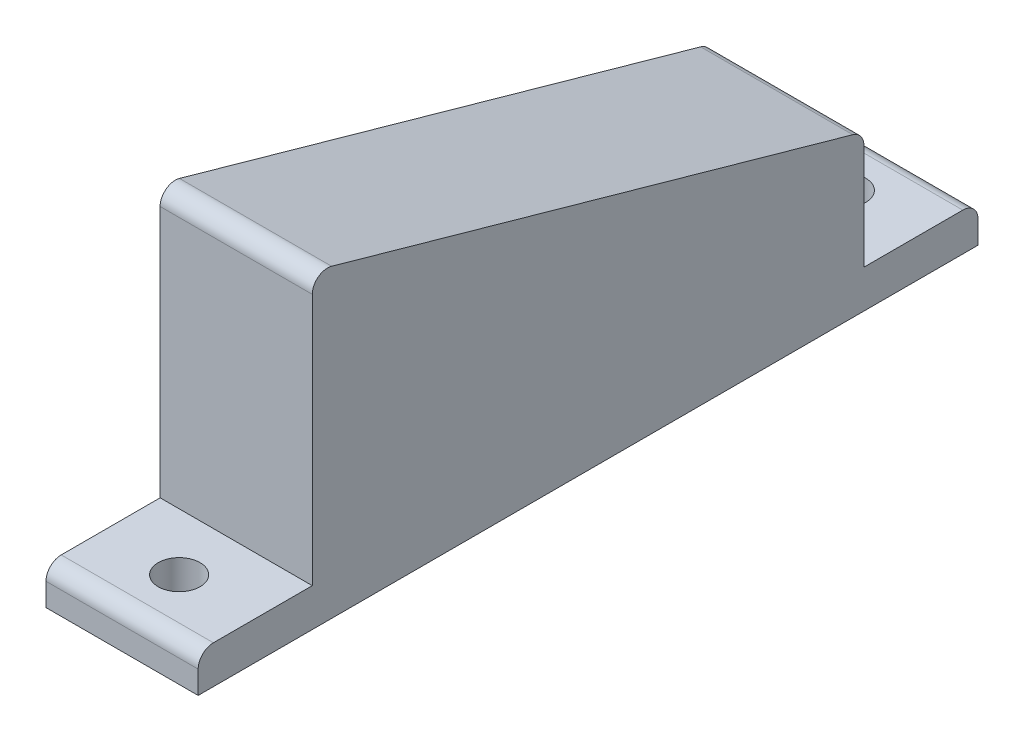
ISO-10303-21;
HEADER;
FILE_DESCRIPTION(('STEP AP214'),'2;1');
FILE_NAME('part.step','',(''),(''),'','','');
FILE_SCHEMA(('AUTOMOTIVE_DESIGN { 1 0 10303 214 1 1 1 1 }'));
ENDSEC;
DATA;
#1=APPLICATION_CONTEXT('core data for automotive mechanical design processes');
#2=APPLICATION_PROTOCOL_DEFINITION('international standard','automotive_design',2000,#1);
#3=PRODUCT_CONTEXT('',#1,'mechanical');
#4=PRODUCT('Part','Part','',(#3));
#5=PRODUCT_RELATED_PRODUCT_CATEGORY('part','',(#4));
#6=PRODUCT_DEFINITION_FORMATION('','',#4);
#7=PRODUCT_DEFINITION_CONTEXT('part definition',#1,'design');
#8=PRODUCT_DEFINITION('design','',#6,#7);
#9=PRODUCT_DEFINITION_SHAPE('','',#8);
#10=(LENGTH_UNIT() NAMED_UNIT(*) SI_UNIT(.MILLI.,.METRE.));
#11=(NAMED_UNIT(*) PLANE_ANGLE_UNIT() SI_UNIT($,.RADIAN.));
#12=(NAMED_UNIT(*) SI_UNIT($,.STERADIAN.) SOLID_ANGLE_UNIT());
#13=UNCERTAINTY_MEASURE_WITH_UNIT(LENGTH_MEASURE(1.E-05),#10,'distance_accuracy_value','');
#14=(GEOMETRIC_REPRESENTATION_CONTEXT(3) GLOBAL_UNCERTAINTY_ASSIGNED_CONTEXT((#13)) GLOBAL_UNIT_ASSIGNED_CONTEXT((#10,
#11,#12)) REPRESENTATION_CONTEXT('',''));
#15=CARTESIAN_POINT('',(0.,0.,0.));
#16=DIRECTION('',(0.,0.,1.));
#17=DIRECTION('',(1.,0.,0.));
#18=AXIS2_PLACEMENT_3D('',#15,#16,#17);
#19=CARTESIAN_POINT('',(20.,40.8,38.3867604846492));
#20=DIRECTION('',(0.,-0.962618490491296,0.27086092697962));
#21=DIRECTION('',(0.,-0.27086092697962,-0.962618490491296));
#22=AXIS2_PLACEMENT_3D('',#19,#20,#21);
#23=PLANE('',#22);
#24=DIRECTION('',(0.,0.27086092697962,0.962618490491296));
#25=VECTOR('',#24,1.);
#26=CARTESIAN_POINT('',(0.,40.8,38.3867604846492));
#27=LINE('',#26,#25);
#28=CARTESIAN_POINT('',(0.,20.8103292990239,-32.6549613693101));
#29=VERTEX_POINT('',#28);
#30=CARTESIAN_POINT('',(0.,40.0848120576446,35.8450386306899));
#31=VERTEX_POINT('',#30);
#32=EDGE_CURVE('E190',#29,#31,#27,.T.);
#33=ORIENTED_EDGE('',*,*,#32,.T.);
#34=DIRECTION('',(-1.,0.,0.));
#35=VECTOR('',#34,1.);
#36=CARTESIAN_POINT('',(20.,40.0848120576446,35.8450386306899));
#37=LINE('',#36,#35);
#38=CARTESIAN_POINT('',(20.,40.0848120576446,35.8450386306899));
#39=VERTEX_POINT('',#38);
#40=EDGE_CURVE('E47',#31,#39,#37,.F.);
#41=ORIENTED_EDGE('',*,*,#40,.T.);
#42=DIRECTION('',(0.,0.27086092697962,0.962618490491296));
#43=VECTOR('',#42,1.);
#44=CARTESIAN_POINT('',(20.,40.8,38.3867604846492));
#45=LINE('',#44,#43);
#46=CARTESIAN_POINT('',(20.,20.8103292990239,-32.6549613693101));
#47=VERTEX_POINT('',#46);
#48=EDGE_CURVE('E192',#47,#39,#45,.T.);
#49=ORIENTED_EDGE('',*,*,#48,.F.);
#50=DIRECTION('',(-1.,0.,0.));
#51=VECTOR('',#50,1.);
#52=CARTESIAN_POINT('',(20.,20.8103292990239,-32.6549613693101));
#53=LINE('',#52,#51);
#54=EDGE_CURVE('E230',#47,#29,#53,.T.);
#55=ORIENTED_EDGE('',*,*,#54,.T.);
#56=EDGE_LOOP('',(#33,#41,#49,#55));
#57=FACE_BOUND('',#56,.T.);
#58=ADVANCED_FACE('F39',(#57),#23,.F.);
#59=CARTESIAN_POINT('',(20.,40.8,38.3867604846492));
#60=DIRECTION('',(0.,0.,-1.));
#61=DIRECTION('',(0.,1.,0.));
#62=AXIS2_PLACEMENT_3D('',#59,#60,#61);
#63=PLANE('',#62);
#64=DIRECTION('',(0.,-1.,0.));
#65=VECTOR('',#64,1.);
#66=CARTESIAN_POINT('',(20.,40.8,38.3867604846492));
#67=LINE('',#66,#65);
#68=CARTESIAN_POINT('',(20.,38.159575076662,38.3867604846492));
#69=VERTEX_POINT('',#68);
#70=CARTESIAN_POINT('',(20.,5.,38.3867604846491));
#71=VERTEX_POINT('',#70);
#72=EDGE_CURVE('E148',#69,#71,#67,.T.);
#73=ORIENTED_EDGE('',*,*,#72,.F.);
#74=DIRECTION('',(-1.,0.,0.));
#75=VECTOR('',#74,1.);
#76=CARTESIAN_POINT('',(20.,38.159575076662,38.3867604846492));
#77=LINE('',#76,#75);
#78=CARTESIAN_POINT('',(0.,38.159575076662,38.3867604846492));
#79=VERTEX_POINT('',#78);
#80=EDGE_CURVE('E227',#69,#79,#77,.T.);
#81=ORIENTED_EDGE('',*,*,#80,.T.);
#82=DIRECTION('',(0.,-1.,0.));
#83=VECTOR('',#82,1.);
#84=CARTESIAN_POINT('',(0.,40.8,38.3867604846492));
#85=LINE('',#84,#83);
#86=CARTESIAN_POINT('',(0.,5.,38.3867604846491));
#87=VERTEX_POINT('',#86);
#88=EDGE_CURVE('E201',#79,#87,#85,.T.);
#89=ORIENTED_EDGE('',*,*,#88,.T.);
#90=DIRECTION('',(1.,0.,0.));
#91=VECTOR('',#90,1.);
#92=CARTESIAN_POINT('',(0.,5.,38.3867604846491));
#93=LINE('',#92,#91);
#94=EDGE_CURVE('E182',#87,#71,#93,.T.);
#95=ORIENTED_EDGE('',*,*,#94,.T.);
#96=EDGE_LOOP('',(#73,#81,#89,#95));
#97=FACE_BOUND('',#96,.T.);
#98=ADVANCED_FACE('F245',(#97),#63,.F.);
#99=CARTESIAN_POINT('',(20.,0.,38.3867604846491));
#100=DIRECTION('',(0.,1.,0.));
#101=DIRECTION('',(0.,0.,1.));
#102=AXIS2_PLACEMENT_3D('',#99,#100,#101);
#103=PLANE('',#102);
#104=DIRECTION('',(0.,0.,-1.));
#105=VECTOR('',#104,1.);
#106=CARTESIAN_POINT('',(0.,0.,38.3867604846491));
#107=LINE('',#106,#105);
#108=CARTESIAN_POINT('',(0.,0.,53.3867604846491));
#109=VERTEX_POINT('',#108);
#110=CARTESIAN_POINT('',(0.,0.,-49.1132395153509));
#111=VERTEX_POINT('',#110);
#112=EDGE_CURVE('E154',#109,#111,#107,.T.);
#113=ORIENTED_EDGE('',*,*,#112,.T.);
#114=DIRECTION('',(1.,0.,0.));
#115=VECTOR('',#114,1.);
#116=CARTESIAN_POINT('',(20.,0.,-49.1132395153508));
#117=LINE('',#116,#115);
#118=CARTESIAN_POINT('',(20.,0.,-49.1132395153508));
#119=VERTEX_POINT('',#118);
#120=EDGE_CURVE('E133',#111,#119,#117,.T.);
#121=ORIENTED_EDGE('',*,*,#120,.T.);
#122=DIRECTION('',(0.,0.,-1.));
#123=VECTOR('',#122,1.);
#124=CARTESIAN_POINT('',(20.,0.,38.3867604846491));
#125=LINE('',#124,#123);
#126=CARTESIAN_POINT('',(20.,0.,53.3867604846491));
#127=VERTEX_POINT('',#126);
#128=EDGE_CURVE('E139',#127,#119,#125,.T.);
#129=ORIENTED_EDGE('',*,*,#128,.F.);
#130=DIRECTION('',(-1.,0.,0.));
#131=VECTOR('',#130,1.);
#132=CARTESIAN_POINT('',(0.,0.,53.3867604846491));
#133=LINE('',#132,#131);
#134=EDGE_CURVE('E176',#127,#109,#133,.T.);
#135=ORIENTED_EDGE('',*,*,#134,.T.);
#136=EDGE_LOOP('',(#113,#121,#129,#135));
#137=FACE_BOUND('',#136,.T.);
#138=CARTESIAN_POINT('',(10.,0.,45.8867604846492));
#139=DIRECTION('',(0.,-1.,0.));
#140=DIRECTION('',(0.,0.,1.));
#141=AXIS2_PLACEMENT_3D('',#138,#139,#140);
#142=CIRCLE('',#141,2.75);
#143=CARTESIAN_POINT('',(10.,0.,48.6367604846492));
#144=VERTEX_POINT('',#143);
#145=EDGE_CURVE('E171',#144,#144,#142,.T.);
#146=ORIENTED_EDGE('',*,*,#145,.F.);
#147=EDGE_LOOP('',(#146));
#148=FACE_BOUND('',#147,.T.);
#149=CARTESIAN_POINT('',(10.,0.,-41.6132395153509));
#150=DIRECTION('',(0.,-1.,0.));
#151=DIRECTION('',(0.,0.,-1.));
#152=AXIS2_PLACEMENT_3D('',#149,#150,#151);
#153=CIRCLE('',#152,2.75);
#154=CARTESIAN_POINT('',(10.,0.,-44.3632395153509));
#155=VERTEX_POINT('',#154);
#156=EDGE_CURVE('E159',#155,#155,#153,.T.);
#157=ORIENTED_EDGE('',*,*,#156,.F.);
#158=EDGE_LOOP('',(#157));
#159=FACE_BOUND('',#158,.T.);
#160=ADVANCED_FACE('F151',(#137,#148,#159),#103,.F.);
#161=CARTESIAN_POINT('',(20.,0.,-34.1132395153508));
#162=DIRECTION('',(0.,0.,1.));
#163=DIRECTION('',(0.,-1.,0.));
#164=AXIS2_PLACEMENT_3D('',#161,#162,#163);
#165=PLANE('',#164);
#166=DIRECTION('',(0.,1.,0.));
#167=VECTOR('',#166,1.);
#168=CARTESIAN_POINT('',(0.,0.,-34.1132395153508));
#169=LINE('',#168,#167);
#170=CARTESIAN_POINT('',(0.,5.,-34.1132395153508));
#171=VERTEX_POINT('',#170);
#172=CARTESIAN_POINT('',(0.,18.8850923180413,-34.1132395153508));
#173=VERTEX_POINT('',#172);
#174=EDGE_CURVE('E195',#171,#173,#169,.T.);
#175=ORIENTED_EDGE('',*,*,#174,.T.);
#176=DIRECTION('',(-1.,0.,0.));
#177=VECTOR('',#176,1.);
#178=CARTESIAN_POINT('',(20.,18.8850923180413,-34.1132395153508));
#179=LINE('',#178,#177);
#180=CARTESIAN_POINT('',(20.,18.8850923180413,-34.1132395153508));
#181=VERTEX_POINT('',#180);
#182=EDGE_CURVE('E11',#173,#181,#179,.F.);
#183=ORIENTED_EDGE('',*,*,#182,.T.);
#184=DIRECTION('',(0.,1.,0.));
#185=VECTOR('',#184,1.);
#186=CARTESIAN_POINT('',(20.,0.,-34.1132395153508));
#187=LINE('',#186,#185);
#188=CARTESIAN_POINT('',(20.,5.,-34.1132395153508));
#189=VERTEX_POINT('',#188);
#190=EDGE_CURVE('E147',#189,#181,#187,.T.);
#191=ORIENTED_EDGE('',*,*,#190,.F.);
#192=DIRECTION('',(-1.,0.,0.));
#193=VECTOR('',#192,1.);
#194=CARTESIAN_POINT('',(20.,5.,-34.1132395153508));
#195=LINE('',#194,#193);
#196=EDGE_CURVE('E161',#189,#171,#195,.T.);
#197=ORIENTED_EDGE('',*,*,#196,.T.);
#198=EDGE_LOOP('',(#175,#183,#191,#197));
#199=FACE_BOUND('',#198,.T.);
#200=ADVANCED_FACE('F269',(#199),#165,.F.);
#201=CARTESIAN_POINT('',(20.,0.,0.));
#202=DIRECTION('',(1.,0.,0.));
#203=DIRECTION('',(0.,0.,-1.));
#204=AXIS2_PLACEMENT_3D('',#201,#202,#203);
#205=PLANE('',#204);
#206=DIRECTION('',(0.,0.,1.));
#207=VECTOR('',#206,1.);
#208=CARTESIAN_POINT('',(20.,5.,38.3867604846491));
#209=LINE('',#208,#207);
#210=CARTESIAN_POINT('',(20.,5.,51.3867604846491));
#211=VERTEX_POINT('',#210);
#212=EDGE_CURVE('E185',#71,#211,#209,.T.);
#213=ORIENTED_EDGE('',*,*,#212,.T.);
#214=CARTESIAN_POINT('',(20.,3.,51.3867604846491));
#215=DIRECTION('',(1.,0.,0.));
#216=DIRECTION('',(0.,0.,-1.));
#217=AXIS2_PLACEMENT_3D('',#214,#215,#216);
#218=CIRCLE('',#217,2.);
#219=CARTESIAN_POINT('',(20.,3.,53.3867604846491));
#220=VERTEX_POINT('',#219);
#221=EDGE_CURVE('E222',#211,#220,#218,.T.);
#222=ORIENTED_EDGE('',*,*,#221,.T.);
#223=DIRECTION('',(0.,-1.,0.));
#224=VECTOR('',#223,1.);
#225=CARTESIAN_POINT('',(20.,5.,53.3867604846491));
#226=LINE('',#225,#224);
#227=EDGE_CURVE('E143',#220,#127,#226,.T.);
#228=ORIENTED_EDGE('',*,*,#227,.T.);
#229=ORIENTED_EDGE('',*,*,#128,.T.);
#230=DIRECTION('',(0.,-1.,0.));
#231=VECTOR('',#230,1.);
#232=CARTESIAN_POINT('',(20.,5.,-49.1132395153508));
#233=LINE('',#232,#231);
#234=CARTESIAN_POINT('',(20.,3.,-49.1132395153508));
#235=VERTEX_POINT('',#234);
#236=EDGE_CURVE('E128',#235,#119,#233,.T.);
#237=ORIENTED_EDGE('',*,*,#236,.F.);
#238=CARTESIAN_POINT('',(20.,3.,-47.1132395153508));
#239=DIRECTION('',(1.,0.,0.));
#240=DIRECTION('',(0.,0.,-1.));
#241=AXIS2_PLACEMENT_3D('',#238,#239,#240);
#242=CIRCLE('',#241,2.);
#243=CARTESIAN_POINT('',(20.,5.,-47.1132395153508));
#244=VERTEX_POINT('',#243);
#245=EDGE_CURVE('E60',#235,#244,#242,.T.);
#246=ORIENTED_EDGE('',*,*,#245,.T.);
#247=DIRECTION('',(0.,0.,1.));
#248=VECTOR('',#247,1.);
#249=CARTESIAN_POINT('',(20.,5.,-34.1132395153508));
#250=LINE('',#249,#248);
#251=EDGE_CURVE('E156',#244,#189,#250,.T.);
#252=ORIENTED_EDGE('',*,*,#251,.T.);
#253=ORIENTED_EDGE('',*,*,#190,.T.);
#254=CARTESIAN_POINT('',(20.,18.8850923180413,-32.1132395153508));
#255=DIRECTION('',(1.,0.,0.));
#256=DIRECTION('',(0.,0.,-1.));
#257=AXIS2_PLACEMENT_3D('',#254,#255,#256);
#258=CIRCLE('',#257,2.);
#259=EDGE_CURVE('E217',#181,#47,#258,.T.);
#260=ORIENTED_EDGE('',*,*,#259,.T.);
#261=ORIENTED_EDGE('',*,*,#48,.T.);
#262=CARTESIAN_POINT('',(20.,38.159575076662,36.3867604846492));
#263=DIRECTION('',(1.,0.,0.));
#264=DIRECTION('',(0.,0.,-1.));
#265=AXIS2_PLACEMENT_3D('',#262,#263,#264);
#266=CIRCLE('',#265,2.);
#267=EDGE_CURVE('E219',#39,#69,#266,.T.);
#268=ORIENTED_EDGE('',*,*,#267,.T.);
#269=ORIENTED_EDGE('',*,*,#72,.T.);
#270=EDGE_LOOP('',(#213,#222,#228,#229,#237,#246,#252,#253,#260,#261,#268,#269));
#271=FACE_BOUND('',#270,.T.);
#272=ADVANCED_FACE('F141',(#271),#205,.T.);
#273=CARTESIAN_POINT('',(0.,0.,0.));
#274=DIRECTION('',(1.,0.,0.));
#275=DIRECTION('',(0.,0.,-1.));
#276=AXIS2_PLACEMENT_3D('',#273,#274,#275);
#277=PLANE('',#276);
#278=DIRECTION('',(0.,-1.,0.));
#279=VECTOR('',#278,1.);
#280=CARTESIAN_POINT('',(0.,5.,53.3867604846491));
#281=LINE('',#280,#279);
#282=CARTESIAN_POINT('',(0.,3.,53.3867604846491));
#283=VERTEX_POINT('',#282);
#284=EDGE_CURVE('E188',#283,#109,#281,.T.);
#285=ORIENTED_EDGE('',*,*,#284,.F.);
#286=CARTESIAN_POINT('',(0.,3.,51.3867604846491));
#287=DIRECTION('',(1.,0.,0.));
#288=DIRECTION('',(0.,0.,-1.));
#289=AXIS2_PLACEMENT_3D('',#286,#287,#288);
#290=CIRCLE('',#289,2.);
#291=CARTESIAN_POINT('',(0.,5.,51.3867604846491));
#292=VERTEX_POINT('',#291);
#293=EDGE_CURVE('E213',#283,#292,#290,.F.);
#294=ORIENTED_EDGE('',*,*,#293,.T.);
#295=DIRECTION('',(0.,0.,-1.));
#296=VECTOR('',#295,1.);
#297=CARTESIAN_POINT('',(0.,5.,38.3867604846491));
#298=LINE('',#297,#296);
#299=EDGE_CURVE('E179',#292,#87,#298,.T.);
#300=ORIENTED_EDGE('',*,*,#299,.T.);
#301=ORIENTED_EDGE('',*,*,#88,.F.);
#302=CARTESIAN_POINT('',(0.,38.159575076662,36.3867604846492));
#303=DIRECTION('',(1.,0.,0.));
#304=DIRECTION('',(0.,0.,-1.));
#305=AXIS2_PLACEMENT_3D('',#302,#303,#304);
#306=CIRCLE('',#305,2.);
#307=EDGE_CURVE('E209',#79,#31,#306,.F.);
#308=ORIENTED_EDGE('',*,*,#307,.T.);
#309=ORIENTED_EDGE('',*,*,#32,.F.);
#310=CARTESIAN_POINT('',(0.,18.8850923180413,-32.1132395153508));
#311=DIRECTION('',(1.,0.,0.));
#312=DIRECTION('',(0.,0.,-1.));
#313=AXIS2_PLACEMENT_3D('',#310,#311,#312);
#314=CIRCLE('',#313,2.);
#315=EDGE_CURVE('E207',#29,#173,#314,.F.);
#316=ORIENTED_EDGE('',*,*,#315,.T.);
#317=ORIENTED_EDGE('',*,*,#174,.F.);
#318=DIRECTION('',(0.,0.,-1.));
#319=VECTOR('',#318,1.);
#320=CARTESIAN_POINT('',(0.,5.,-34.1132395153508));
#321=LINE('',#320,#319);
#322=CARTESIAN_POINT('',(0.,5.,-47.1132395153509));
#323=VERTEX_POINT('',#322);
#324=EDGE_CURVE('E165',#171,#323,#321,.T.);
#325=ORIENTED_EDGE('',*,*,#324,.T.);
#326=CARTESIAN_POINT('',(0.,3.,-47.1132395153509));
#327=DIRECTION('',(1.,0.,0.));
#328=DIRECTION('',(0.,0.,-1.));
#329=AXIS2_PLACEMENT_3D('',#326,#327,#328);
#330=CIRCLE('',#329,2.);
#331=CARTESIAN_POINT('',(0.,3.,-49.1132395153509));
#332=VERTEX_POINT('',#331);
#333=EDGE_CURVE('E211',#323,#332,#330,.F.);
#334=ORIENTED_EDGE('',*,*,#333,.T.);
#335=DIRECTION('',(0.,-1.,0.));
#336=VECTOR('',#335,1.);
#337=CARTESIAN_POINT('',(0.,5.,-49.1132395153509));
#338=LINE('',#337,#336);
#339=EDGE_CURVE('E136',#332,#111,#338,.T.);
#340=ORIENTED_EDGE('',*,*,#339,.T.);
#341=ORIENTED_EDGE('',*,*,#112,.F.);
#342=EDGE_LOOP('',(#285,#294,#300,#301,#308,#309,#316,#317,#325,#334,#340,#341));
#343=FACE_BOUND('',#342,.T.);
#344=ADVANCED_FACE('F248',(#343),#277,.F.);
#345=CARTESIAN_POINT('',(0.,5.,53.3867604846491));
#346=DIRECTION('',(0.,0.,1.));
#347=DIRECTION('',(1.,0.,0.));
#348=AXIS2_PLACEMENT_3D('',#345,#346,#347);
#349=PLANE('',#348);
#350=ORIENTED_EDGE('',*,*,#227,.F.);
#351=DIRECTION('',(-1.,0.,0.));
#352=VECTOR('',#351,1.);
#353=CARTESIAN_POINT('',(0.,3.,53.3867604846491));
#354=LINE('',#353,#352);
#355=EDGE_CURVE('E198',#220,#283,#354,.T.);
#356=ORIENTED_EDGE('',*,*,#355,.T.);
#357=ORIENTED_EDGE('',*,*,#284,.T.);
#358=ORIENTED_EDGE('',*,*,#134,.F.);
#359=EDGE_LOOP('',(#350,#356,#357,#358));
#360=FACE_BOUND('',#359,.T.);
#361=ADVANCED_FACE('F260',(#360),#349,.T.);
#362=CARTESIAN_POINT('',(0.,5.,0.));
#363=DIRECTION('',(0.,1.,0.));
#364=DIRECTION('',(0.,0.,1.));
#365=AXIS2_PLACEMENT_3D('',#362,#363,#364);
#366=PLANE('',#365);
#367=CARTESIAN_POINT('',(10.,5.,45.8867604846492));
#368=DIRECTION('',(0.,-1.,0.));
#369=DIRECTION('',(0.,0.,1.));
#370=AXIS2_PLACEMENT_3D('',#367,#368,#369);
#371=CIRCLE('',#370,2.75);
#372=CARTESIAN_POINT('',(10.,5.,48.6367604846492));
#373=VERTEX_POINT('',#372);
#374=EDGE_CURVE('E173',#373,#373,#371,.T.);
#375=ORIENTED_EDGE('',*,*,#374,.T.);
#376=EDGE_LOOP('',(#375));
#377=FACE_BOUND('',#376,.T.);
#378=ORIENTED_EDGE('',*,*,#299,.F.);
#379=DIRECTION('',(-1.,0.,0.));
#380=VECTOR('',#379,1.);
#381=CARTESIAN_POINT('',(0.,5.,51.3867604846491));
#382=LINE('',#381,#380);
#383=EDGE_CURVE('E215',#292,#211,#382,.F.);
#384=ORIENTED_EDGE('',*,*,#383,.T.);
#385=ORIENTED_EDGE('',*,*,#212,.F.);
#386=ORIENTED_EDGE('',*,*,#94,.F.);
#387=EDGE_LOOP('',(#378,#384,#385,#386));
#388=FACE_BOUND('',#387,.T.);
#389=ADVANCED_FACE('F254',(#377,#388),#366,.T.);
#390=CARTESIAN_POINT('',(10.,5.,45.8867604846492));
#391=DIRECTION('',(0.,-1.,0.));
#392=DIRECTION('',(0.,0.,-1.));
#393=AXIS2_PLACEMENT_3D('',#390,#391,#392);
#394=CYLINDRICAL_SURFACE('',#393,2.75);
#395=ORIENTED_EDGE('',*,*,#374,.F.);
#396=EDGE_LOOP('',(#395));
#397=FACE_BOUND('',#396,.T.);
#398=ORIENTED_EDGE('',*,*,#145,.T.);
#399=EDGE_LOOP('',(#398));
#400=FACE_BOUND('',#399,.T.);
#401=ADVANCED_FACE('F330',(#397,#400),#394,.F.);
#402=CARTESIAN_POINT('',(20.,5.,-49.1132395153508));
#403=DIRECTION('',(0.,0.,-1.));
#404=DIRECTION('',(-1.,0.,0.));
#405=AXIS2_PLACEMENT_3D('',#402,#403,#404);
#406=PLANE('',#405);
#407=ORIENTED_EDGE('',*,*,#339,.F.);
#408=DIRECTION('',(1.,0.,0.));
#409=VECTOR('',#408,1.);
#410=CARTESIAN_POINT('',(20.,3.,-49.1132395153508));
#411=LINE('',#410,#409);
#412=EDGE_CURVE('E135',#332,#235,#411,.T.);
#413=ORIENTED_EDGE('',*,*,#412,.T.);
#414=ORIENTED_EDGE('',*,*,#236,.T.);
#415=ORIENTED_EDGE('',*,*,#120,.F.);
#416=EDGE_LOOP('',(#407,#413,#414,#415));
#417=FACE_BOUND('',#416,.T.);
#418=ADVANCED_FACE('F131',(#417),#406,.T.);
#419=CARTESIAN_POINT('',(0.,5.,0.));
#420=DIRECTION('',(0.,1.,0.));
#421=DIRECTION('',(0.,0.,1.));
#422=AXIS2_PLACEMENT_3D('',#419,#420,#421);
#423=PLANE('',#422);
#424=CARTESIAN_POINT('',(10.,5.,-41.6132395153509));
#425=DIRECTION('',(0.,-1.,0.));
#426=DIRECTION('',(0.,0.,-1.));
#427=AXIS2_PLACEMENT_3D('',#424,#425,#426);
#428=CIRCLE('',#427,2.75);
#429=CARTESIAN_POINT('',(10.,5.,-44.3632395153509));
#430=VERTEX_POINT('',#429);
#431=EDGE_CURVE('E155',#430,#430,#428,.T.);
#432=ORIENTED_EDGE('',*,*,#431,.T.);
#433=EDGE_LOOP('',(#432));
#434=FACE_BOUND('',#433,.T.);
#435=ORIENTED_EDGE('',*,*,#251,.F.);
#436=DIRECTION('',(1.,0.,0.));
#437=VECTOR('',#436,1.);
#438=CARTESIAN_POINT('',(0.,5.,-47.1132395153509));
#439=LINE('',#438,#437);
#440=EDGE_CURVE('E225',#244,#323,#439,.F.);
#441=ORIENTED_EDGE('',*,*,#440,.T.);
#442=ORIENTED_EDGE('',*,*,#324,.F.);
#443=ORIENTED_EDGE('',*,*,#196,.F.);
#444=EDGE_LOOP('',(#435,#441,#442,#443));
#445=FACE_BOUND('',#444,.T.);
#446=ADVANCED_FACE('F266',(#434,#445),#423,.T.);
#447=CARTESIAN_POINT('',(10.,5.,-41.6132395153509));
#448=DIRECTION('',(0.,-1.,0.));
#449=DIRECTION('',(0.,0.,-1.));
#450=AXIS2_PLACEMENT_3D('',#447,#448,#449);
#451=CYLINDRICAL_SURFACE('',#450,2.75);
#452=ORIENTED_EDGE('',*,*,#431,.F.);
#453=EDGE_LOOP('',(#452));
#454=FACE_BOUND('',#453,.T.);
#455=ORIENTED_EDGE('',*,*,#156,.T.);
#456=EDGE_LOOP('',(#455));
#457=FACE_BOUND('',#456,.T.);
#458=ADVANCED_FACE('F286',(#454,#457),#451,.F.);
#459=CARTESIAN_POINT('',(0.,3.,51.3867604846491));
#460=DIRECTION('',(-1.,0.,0.));
#461=DIRECTION('',(0.,0.,1.));
#462=AXIS2_PLACEMENT_3D('',#459,#460,#461);
#463=CYLINDRICAL_SURFACE('',#462,2.);
#464=ORIENTED_EDGE('',*,*,#221,.F.);
#465=ORIENTED_EDGE('',*,*,#383,.F.);
#466=ORIENTED_EDGE('',*,*,#293,.F.);
#467=ORIENTED_EDGE('',*,*,#355,.F.);
#468=EDGE_LOOP('',(#464,#465,#466,#467));
#469=FACE_BOUND('',#468,.T.);
#470=ADVANCED_FACE('F258',(#469),#463,.T.);
#471=CARTESIAN_POINT('',(20.,3.,-47.1132395153508));
#472=DIRECTION('',(1.,0.,0.));
#473=DIRECTION('',(0.,0.,-1.));
#474=AXIS2_PLACEMENT_3D('',#471,#472,#473);
#475=CYLINDRICAL_SURFACE('',#474,2.);
#476=ORIENTED_EDGE('',*,*,#333,.F.);
#477=ORIENTED_EDGE('',*,*,#440,.F.);
#478=ORIENTED_EDGE('',*,*,#245,.F.);
#479=ORIENTED_EDGE('',*,*,#412,.F.);
#480=EDGE_LOOP('',(#476,#477,#478,#479));
#481=FACE_BOUND('',#480,.T.);
#482=ADVANCED_FACE('F263',(#481),#475,.T.);
#483=CARTESIAN_POINT('',(20.,38.159575076662,36.3867604846492));
#484=DIRECTION('',(-1.,0.,0.));
#485=DIRECTION('',(0.,0.,1.));
#486=AXIS2_PLACEMENT_3D('',#483,#484,#485);
#487=CYLINDRICAL_SURFACE('',#486,2.);
#488=ORIENTED_EDGE('',*,*,#267,.F.);
#489=ORIENTED_EDGE('',*,*,#40,.F.);
#490=ORIENTED_EDGE('',*,*,#307,.F.);
#491=ORIENTED_EDGE('',*,*,#80,.F.);
#492=EDGE_LOOP('',(#488,#489,#490,#491));
#493=FACE_BOUND('',#492,.T.);
#494=ADVANCED_FACE('F242',(#493),#487,.T.);
#495=CARTESIAN_POINT('',(20.,18.8850923180413,-32.1132395153508));
#496=DIRECTION('',(-1.,0.,0.));
#497=DIRECTION('',(0.,0.,1.));
#498=AXIS2_PLACEMENT_3D('',#495,#496,#497);
#499=CYLINDRICAL_SURFACE('',#498,2.);
#500=ORIENTED_EDGE('',*,*,#259,.F.);
#501=ORIENTED_EDGE('',*,*,#182,.F.);
#502=ORIENTED_EDGE('',*,*,#315,.F.);
#503=ORIENTED_EDGE('',*,*,#54,.F.);
#504=EDGE_LOOP('',(#500,#501,#502,#503));
#505=FACE_BOUND('',#504,.T.);
#506=ADVANCED_FACE('F41',(#505),#499,.T.);
#507=CLOSED_SHELL('',(#58,#98,#160,#200,#272,#344,#361,#389,#401,#418,#446,#458,#470,#482,#494,#506));
#508=MANIFOLD_SOLID_BREP('B2',#507);
#509=ADVANCED_BREP_SHAPE_REPRESENTATION('',(#18,#508),#14);
#510=SHAPE_DEFINITION_REPRESENTATION(#9,#509);
ENDSEC;
END-ISO-10303-21;
